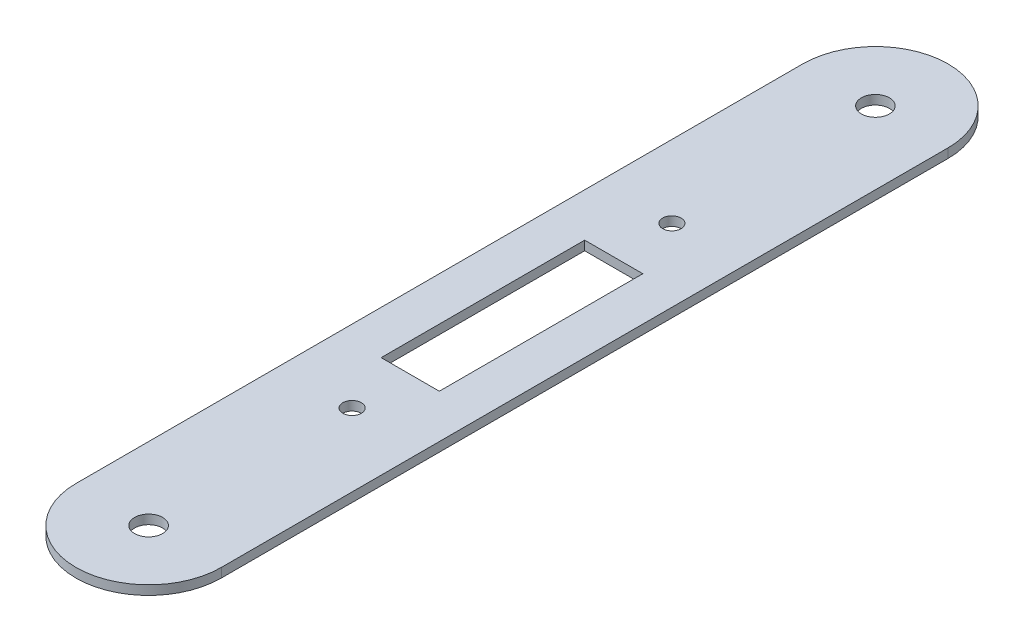
ISO-10303-21;
HEADER;
FILE_DESCRIPTION(('STEP AP214'),'2;1');
FILE_NAME('part.step','',(''),(''),'','','');
FILE_SCHEMA(('AUTOMOTIVE_DESIGN { 1 0 10303 214 1 1 1 1 }'));
ENDSEC;
DATA;
#1=APPLICATION_CONTEXT('core data for automotive mechanical design processes');
#2=APPLICATION_PROTOCOL_DEFINITION('international standard','automotive_design',2000,#1);
#3=PRODUCT_CONTEXT('',#1,'mechanical');
#4=PRODUCT('Part','Part','',(#3));
#5=PRODUCT_RELATED_PRODUCT_CATEGORY('part','',(#4));
#6=PRODUCT_DEFINITION_FORMATION('','',#4);
#7=PRODUCT_DEFINITION_CONTEXT('part definition',#1,'design');
#8=PRODUCT_DEFINITION('design','',#6,#7);
#9=PRODUCT_DEFINITION_SHAPE('','',#8);
#10=(LENGTH_UNIT() NAMED_UNIT(*) SI_UNIT(.MILLI.,.METRE.));
#11=(NAMED_UNIT(*) PLANE_ANGLE_UNIT() SI_UNIT($,.RADIAN.));
#12=(NAMED_UNIT(*) SI_UNIT($,.STERADIAN.) SOLID_ANGLE_UNIT());
#13=UNCERTAINTY_MEASURE_WITH_UNIT(LENGTH_MEASURE(1.E-05),#10,'distance_accuracy_value','');
#14=(GEOMETRIC_REPRESENTATION_CONTEXT(3) GLOBAL_UNCERTAINTY_ASSIGNED_CONTEXT((#13)) GLOBAL_UNIT_ASSIGNED_CONTEXT((#10,
#11,#12)) REPRESENTATION_CONTEXT('',''));
#15=CARTESIAN_POINT('',(0.,0.,0.));
#16=DIRECTION('',(0.,0.,1.));
#17=DIRECTION('',(1.,0.,0.));
#18=AXIS2_PLACEMENT_3D('',#15,#16,#17);
#19=CARTESIAN_POINT('',(0.,3.175,0.));
#20=DIRECTION('',(1.,0.,0.));
#21=DIRECTION('',(0.,0.,-1.));
#22=AXIS2_PLACEMENT_3D('',#19,#20,#21);
#23=PLANE('',#22);
#24=DIRECTION('',(0.,0.,1.));
#25=VECTOR('',#24,1.);
#26=CARTESIAN_POINT('',(0.,0.,0.));
#27=LINE('',#26,#25);
#28=CARTESIAN_POINT('',(0.,0.,25.));
#29=VERTEX_POINT('',#28);
#30=CARTESIAN_POINT('',(0.,0.,275.));
#31=VERTEX_POINT('',#30);
#32=EDGE_CURVE('E155',#29,#31,#27,.T.);
#33=ORIENTED_EDGE('',*,*,#32,.T.);
#34=DIRECTION('',(0.,-1.,0.));
#35=VECTOR('',#34,1.);
#36=CARTESIAN_POINT('',(0.,3.175,275.));
#37=LINE('',#36,#35);
#38=CARTESIAN_POINT('',(0.,3.175,275.));
#39=VERTEX_POINT('',#38);
#40=EDGE_CURVE('E11',#39,#31,#37,.T.);
#41=ORIENTED_EDGE('',*,*,#40,.F.);
#42=DIRECTION('',(0.,0.,1.));
#43=VECTOR('',#42,1.);
#44=CARTESIAN_POINT('',(0.,3.175,0.));
#45=LINE('',#44,#43);
#46=CARTESIAN_POINT('',(0.,3.175,25.));
#47=VERTEX_POINT('',#46);
#48=EDGE_CURVE('E114',#47,#39,#45,.T.);
#49=ORIENTED_EDGE('',*,*,#48,.F.);
#50=DIRECTION('',(0.,-1.,0.));
#51=VECTOR('',#50,1.);
#52=CARTESIAN_POINT('',(0.,3.175,25.));
#53=LINE('',#52,#51);
#54=EDGE_CURVE('E175',#47,#29,#53,.T.);
#55=ORIENTED_EDGE('',*,*,#54,.T.);
#56=EDGE_LOOP('',(#33,#41,#49,#55));
#57=FACE_BOUND('',#56,.T.);
#58=ADVANCED_FACE('F35',(#57),#23,.F.);
#59=CARTESIAN_POINT('',(25.,3.175,275.));
#60=DIRECTION('',(0.,-1.,0.));
#61=DIRECTION('',(0.,0.,-1.));
#62=AXIS2_PLACEMENT_3D('',#59,#60,#61);
#63=CYLINDRICAL_SURFACE('',#62,25.);
#64=CARTESIAN_POINT('',(25.,0.,275.));
#65=DIRECTION('',(0.,1.,0.));
#66=DIRECTION('',(0.,0.,1.));
#67=AXIS2_PLACEMENT_3D('',#64,#65,#66);
#68=CIRCLE('',#67,25.);
#69=CARTESIAN_POINT('',(50.,0.,275.));
#70=VERTEX_POINT('',#69);
#71=EDGE_CURVE('E120',#31,#70,#68,.T.);
#72=ORIENTED_EDGE('',*,*,#71,.T.);
#73=DIRECTION('',(0.,-1.,0.));
#74=VECTOR('',#73,1.);
#75=CARTESIAN_POINT('',(50.,3.175,275.));
#76=LINE('',#75,#74);
#77=CARTESIAN_POINT('',(50.,3.175,275.));
#78=VERTEX_POINT('',#77);
#79=EDGE_CURVE('E45',#78,#70,#76,.T.);
#80=ORIENTED_EDGE('',*,*,#79,.F.);
#81=CARTESIAN_POINT('',(25.,3.175,275.));
#82=DIRECTION('',(0.,1.,0.));
#83=DIRECTION('',(0.,0.,1.));
#84=AXIS2_PLACEMENT_3D('',#81,#82,#83);
#85=CIRCLE('',#84,25.);
#86=EDGE_CURVE('E107',#39,#78,#85,.T.);
#87=ORIENTED_EDGE('',*,*,#86,.F.);
#88=ORIENTED_EDGE('',*,*,#40,.T.);
#89=EDGE_LOOP('',(#72,#80,#87,#88));
#90=FACE_BOUND('',#89,.T.);
#91=ADVANCED_FACE('F119',(#90),#63,.T.);
#92=CARTESIAN_POINT('',(50.,3.175,0.));
#93=DIRECTION('',(1.,0.,0.));
#94=DIRECTION('',(0.,0.,-1.));
#95=AXIS2_PLACEMENT_3D('',#92,#93,#94);
#96=PLANE('',#95);
#97=DIRECTION('',(0.,0.,1.));
#98=VECTOR('',#97,1.);
#99=CARTESIAN_POINT('',(50.,0.,0.));
#100=LINE('',#99,#98);
#101=CARTESIAN_POINT('',(50.,0.,25.));
#102=VERTEX_POINT('',#101);
#103=EDGE_CURVE('E159',#102,#70,#100,.T.);
#104=ORIENTED_EDGE('',*,*,#103,.F.);
#105=DIRECTION('',(0.,-1.,0.));
#106=VECTOR('',#105,1.);
#107=CARTESIAN_POINT('',(50.,3.175,25.));
#108=LINE('',#107,#106);
#109=CARTESIAN_POINT('',(50.,3.175,25.));
#110=VERTEX_POINT('',#109);
#111=EDGE_CURVE('E82',#110,#102,#108,.T.);
#112=ORIENTED_EDGE('',*,*,#111,.F.);
#113=DIRECTION('',(0.,0.,1.));
#114=VECTOR('',#113,1.);
#115=CARTESIAN_POINT('',(50.,3.175,0.));
#116=LINE('',#115,#114);
#117=EDGE_CURVE('E112',#110,#78,#116,.T.);
#118=ORIENTED_EDGE('',*,*,#117,.T.);
#119=ORIENTED_EDGE('',*,*,#79,.T.);
#120=EDGE_LOOP('',(#104,#112,#118,#119));
#121=FACE_BOUND('',#120,.T.);
#122=ADVANCED_FACE('F125',(#121),#96,.T.);
#123=CARTESIAN_POINT('',(0.,3.175,115.));
#124=DIRECTION('',(0.,0.,-1.));
#125=DIRECTION('',(-1.,0.,0.));
#126=AXIS2_PLACEMENT_3D('',#123,#124,#125);
#127=PLANE('',#126);
#128=DIRECTION('',(1.,0.,0.));
#129=VECTOR('',#128,1.);
#130=CARTESIAN_POINT('',(0.,0.,115.));
#131=LINE('',#130,#129);
#132=CARTESIAN_POINT('',(15.,0.,115.));
#133=VERTEX_POINT('',#132);
#134=CARTESIAN_POINT('',(35.,0.,115.));
#135=VERTEX_POINT('',#134);
#136=EDGE_CURVE('E143',#133,#135,#131,.T.);
#137=ORIENTED_EDGE('',*,*,#136,.T.);
#138=DIRECTION('',(0.,-1.,0.));
#139=VECTOR('',#138,1.);
#140=CARTESIAN_POINT('',(35.,3.175,115.));
#141=LINE('',#140,#139);
#142=CARTESIAN_POINT('',(35.,3.175,115.));
#143=VERTEX_POINT('',#142);
#144=EDGE_CURVE('E39',#143,#135,#141,.T.);
#145=ORIENTED_EDGE('',*,*,#144,.F.);
#146=DIRECTION('',(1.,0.,0.));
#147=VECTOR('',#146,1.);
#148=CARTESIAN_POINT('',(0.,3.175,115.));
#149=LINE('',#148,#147);
#150=CARTESIAN_POINT('',(15.,3.175,115.));
#151=VERTEX_POINT('',#150);
#152=EDGE_CURVE('E174',#151,#143,#149,.T.);
#153=ORIENTED_EDGE('',*,*,#152,.F.);
#154=DIRECTION('',(0.,-1.,0.));
#155=VECTOR('',#154,1.);
#156=CARTESIAN_POINT('',(15.,3.175,115.));
#157=LINE('',#156,#155);
#158=EDGE_CURVE('E142',#151,#133,#157,.T.);
#159=ORIENTED_EDGE('',*,*,#158,.T.);
#160=EDGE_LOOP('',(#137,#145,#153,#159));
#161=FACE_BOUND('',#160,.T.);
#162=ADVANCED_FACE('F37',(#161),#127,.F.);
#163=CARTESIAN_POINT('',(35.,3.175,0.));
#164=DIRECTION('',(1.,0.,0.));
#165=DIRECTION('',(0.,0.,-1.));
#166=AXIS2_PLACEMENT_3D('',#163,#164,#165);
#167=PLANE('',#166);
#168=DIRECTION('',(0.,0.,1.));
#169=VECTOR('',#168,1.);
#170=CARTESIAN_POINT('',(35.,0.,0.));
#171=LINE('',#170,#169);
#172=CARTESIAN_POINT('',(35.,0.,185.));
#173=VERTEX_POINT('',#172);
#174=EDGE_CURVE('E146',#135,#173,#171,.T.);
#175=ORIENTED_EDGE('',*,*,#174,.T.);
#176=DIRECTION('',(0.,-1.,0.));
#177=VECTOR('',#176,1.);
#178=CARTESIAN_POINT('',(35.,3.175,185.));
#179=LINE('',#178,#177);
#180=CARTESIAN_POINT('',(35.,3.175,185.));
#181=VERTEX_POINT('',#180);
#182=EDGE_CURVE('E180',#181,#173,#179,.T.);
#183=ORIENTED_EDGE('',*,*,#182,.F.);
#184=DIRECTION('',(0.,0.,1.));
#185=VECTOR('',#184,1.);
#186=CARTESIAN_POINT('',(35.,3.175,0.));
#187=LINE('',#186,#185);
#188=EDGE_CURVE('E94',#143,#181,#187,.T.);
#189=ORIENTED_EDGE('',*,*,#188,.F.);
#190=ORIENTED_EDGE('',*,*,#144,.T.);
#191=EDGE_LOOP('',(#175,#183,#189,#190));
#192=FACE_BOUND('',#191,.T.);
#193=ADVANCED_FACE('F185',(#192),#167,.F.);
#194=CARTESIAN_POINT('',(0.,3.175,185.));
#195=DIRECTION('',(0.,0.,-1.));
#196=DIRECTION('',(-1.,0.,0.));
#197=AXIS2_PLACEMENT_3D('',#194,#195,#196);
#198=PLANE('',#197);
#199=DIRECTION('',(1.,0.,0.));
#200=VECTOR('',#199,1.);
#201=CARTESIAN_POINT('',(0.,0.,185.));
#202=LINE('',#201,#200);
#203=CARTESIAN_POINT('',(15.,0.,185.));
#204=VERTEX_POINT('',#203);
#205=EDGE_CURVE('E149',#204,#173,#202,.T.);
#206=ORIENTED_EDGE('',*,*,#205,.F.);
#207=DIRECTION('',(0.,-1.,0.));
#208=VECTOR('',#207,1.);
#209=CARTESIAN_POINT('',(15.,3.175,185.));
#210=LINE('',#209,#208);
#211=CARTESIAN_POINT('',(15.,3.175,185.));
#212=VERTEX_POINT('',#211);
#213=EDGE_CURVE('E179',#212,#204,#210,.T.);
#214=ORIENTED_EDGE('',*,*,#213,.F.);
#215=DIRECTION('',(1.,0.,0.));
#216=VECTOR('',#215,1.);
#217=CARTESIAN_POINT('',(0.,3.175,185.));
#218=LINE('',#217,#216);
#219=EDGE_CURVE('E318',#212,#181,#218,.T.);
#220=ORIENTED_EDGE('',*,*,#219,.T.);
#221=ORIENTED_EDGE('',*,*,#182,.T.);
#222=EDGE_LOOP('',(#206,#214,#220,#221));
#223=FACE_BOUND('',#222,.T.);
#224=ADVANCED_FACE('F199',(#223),#198,.T.);
#225=CARTESIAN_POINT('',(25.,3.175,25.));
#226=DIRECTION('',(0.,-1.,0.));
#227=DIRECTION('',(0.,0.,-1.));
#228=AXIS2_PLACEMENT_3D('',#225,#226,#227);
#229=CYLINDRICAL_SURFACE('',#228,4.82);
#230=CARTESIAN_POINT('',(25.,3.175,25.));
#231=DIRECTION('',(0.,1.,0.));
#232=DIRECTION('',(0.,0.,1.));
#233=AXIS2_PLACEMENT_3D('',#230,#231,#232);
#234=CIRCLE('',#233,4.82);
#235=CARTESIAN_POINT('',(25.,3.175,29.82));
#236=VERTEX_POINT('',#235);
#237=EDGE_CURVE('E136',#236,#236,#234,.T.);
#238=ORIENTED_EDGE('',*,*,#237,.T.);
#239=EDGE_LOOP('',(#238));
#240=FACE_BOUND('',#239,.T.);
#241=CARTESIAN_POINT('',(25.,0.,25.));
#242=DIRECTION('',(0.,1.,0.));
#243=DIRECTION('',(0.,0.,1.));
#244=AXIS2_PLACEMENT_3D('',#241,#242,#243);
#245=CIRCLE('',#244,4.82);
#246=CARTESIAN_POINT('',(25.,0.,29.82));
#247=VERTEX_POINT('',#246);
#248=EDGE_CURVE('E168',#247,#247,#245,.T.);
#249=ORIENTED_EDGE('',*,*,#248,.F.);
#250=EDGE_LOOP('',(#249));
#251=FACE_BOUND('',#250,.T.);
#252=ADVANCED_FACE('F201',(#240,#251),#229,.F.);
#253=CARTESIAN_POINT('',(25.,3.175,205.));
#254=DIRECTION('',(0.,-1.,0.));
#255=DIRECTION('',(0.,0.,-1.));
#256=AXIS2_PLACEMENT_3D('',#253,#254,#255);
#257=CYLINDRICAL_SURFACE('',#256,3.175);
#258=CARTESIAN_POINT('',(25.,3.175,205.));
#259=DIRECTION('',(0.,1.,0.));
#260=DIRECTION('',(0.,0.,1.));
#261=AXIS2_PLACEMENT_3D('',#258,#259,#260);
#262=CIRCLE('',#261,3.175);
#263=CARTESIAN_POINT('',(25.,3.175,208.175));
#264=VERTEX_POINT('',#263);
#265=EDGE_CURVE('E133',#264,#264,#262,.F.);
#266=ORIENTED_EDGE('',*,*,#265,.F.);
#267=EDGE_LOOP('',(#266));
#268=FACE_BOUND('',#267,.T.);
#269=CARTESIAN_POINT('',(25.,0.,205.));
#270=DIRECTION('',(0.,1.,0.));
#271=DIRECTION('',(0.,0.,1.));
#272=AXIS2_PLACEMENT_3D('',#269,#270,#271);
#273=CIRCLE('',#272,3.175);
#274=CARTESIAN_POINT('',(25.,0.,208.175));
#275=VERTEX_POINT('',#274);
#276=EDGE_CURVE('E165',#275,#275,#273,.F.);
#277=ORIENTED_EDGE('',*,*,#276,.T.);
#278=EDGE_LOOP('',(#277));
#279=FACE_BOUND('',#278,.T.);
#280=ADVANCED_FACE('F207',(#268,#279),#257,.F.);
#281=CARTESIAN_POINT('',(25.,3.175,95.));
#282=DIRECTION('',(0.,-1.,0.));
#283=DIRECTION('',(0.,0.,-1.));
#284=AXIS2_PLACEMENT_3D('',#281,#282,#283);
#285=CYLINDRICAL_SURFACE('',#284,3.175);
#286=CARTESIAN_POINT('',(25.,3.175,95.));
#287=DIRECTION('',(0.,1.,0.));
#288=DIRECTION('',(0.,0.,1.));
#289=AXIS2_PLACEMENT_3D('',#286,#287,#288);
#290=CIRCLE('',#289,3.175);
#291=CARTESIAN_POINT('',(25.,3.175,98.175));
#292=VERTEX_POINT('',#291);
#293=EDGE_CURVE('E127',#292,#292,#290,.T.);
#294=ORIENTED_EDGE('',*,*,#293,.T.);
#295=EDGE_LOOP('',(#294));
#296=FACE_BOUND('',#295,.T.);
#297=CARTESIAN_POINT('',(25.,0.,95.));
#298=DIRECTION('',(0.,1.,0.));
#299=DIRECTION('',(0.,0.,1.));
#300=AXIS2_PLACEMENT_3D('',#297,#298,#299);
#301=CIRCLE('',#300,3.175);
#302=CARTESIAN_POINT('',(25.,0.,98.175));
#303=VERTEX_POINT('',#302);
#304=EDGE_CURVE('E162',#303,#303,#301,.T.);
#305=ORIENTED_EDGE('',*,*,#304,.F.);
#306=EDGE_LOOP('',(#305));
#307=FACE_BOUND('',#306,.T.);
#308=ADVANCED_FACE('F228',(#296,#307),#285,.F.);
#309=CARTESIAN_POINT('',(25.,3.175,25.));
#310=DIRECTION('',(0.,-1.,0.));
#311=DIRECTION('',(0.,0.,-1.));
#312=AXIS2_PLACEMENT_3D('',#309,#310,#311);
#313=CYLINDRICAL_SURFACE('',#312,25.);
#314=CARTESIAN_POINT('',(25.,0.,25.));
#315=DIRECTION('',(0.,1.,0.));
#316=DIRECTION('',(0.,0.,1.));
#317=AXIS2_PLACEMENT_3D('',#314,#315,#316);
#318=CIRCLE('',#317,25.);
#319=EDGE_CURVE('E85',#102,#29,#318,.T.);
#320=ORIENTED_EDGE('',*,*,#319,.T.);
#321=ORIENTED_EDGE('',*,*,#54,.F.);
#322=CARTESIAN_POINT('',(25.,3.175,25.));
#323=DIRECTION('',(0.,1.,0.));
#324=DIRECTION('',(0.,0.,1.));
#325=AXIS2_PLACEMENT_3D('',#322,#323,#324);
#326=CIRCLE('',#325,25.);
#327=EDGE_CURVE('E54',#110,#47,#326,.T.);
#328=ORIENTED_EDGE('',*,*,#327,.F.);
#329=ORIENTED_EDGE('',*,*,#111,.T.);
#330=EDGE_LOOP('',(#320,#321,#328,#329));
#331=FACE_BOUND('',#330,.T.);
#332=ADVANCED_FACE('F221',(#331),#313,.T.);
#333=CARTESIAN_POINT('',(15.,3.175,0.));
#334=DIRECTION('',(1.,0.,0.));
#335=DIRECTION('',(0.,0.,-1.));
#336=AXIS2_PLACEMENT_3D('',#333,#334,#335);
#337=PLANE('',#336);
#338=DIRECTION('',(0.,0.,1.));
#339=VECTOR('',#338,1.);
#340=CARTESIAN_POINT('',(15.,0.,0.));
#341=LINE('',#340,#339);
#342=EDGE_CURVE('E152',#133,#204,#341,.T.);
#343=ORIENTED_EDGE('',*,*,#342,.F.);
#344=ORIENTED_EDGE('',*,*,#158,.F.);
#345=DIRECTION('',(0.,0.,1.));
#346=VECTOR('',#345,1.);
#347=CARTESIAN_POINT('',(15.,3.175,0.));
#348=LINE('',#347,#346);
#349=EDGE_CURVE('E197',#151,#212,#348,.T.);
#350=ORIENTED_EDGE('',*,*,#349,.T.);
#351=ORIENTED_EDGE('',*,*,#213,.T.);
#352=EDGE_LOOP('',(#343,#344,#350,#351));
#353=FACE_BOUND('',#352,.T.);
#354=ADVANCED_FACE('F194',(#353),#337,.T.);
#355=CARTESIAN_POINT('',(25.,3.175,275.));
#356=DIRECTION('',(0.,-1.,0.));
#357=DIRECTION('',(0.,0.,-1.));
#358=AXIS2_PLACEMENT_3D('',#355,#356,#357);
#359=CYLINDRICAL_SURFACE('',#358,4.82);
#360=CARTESIAN_POINT('',(25.,3.175,275.));
#361=DIRECTION('',(0.,1.,0.));
#362=DIRECTION('',(0.,0.,1.));
#363=AXIS2_PLACEMENT_3D('',#360,#361,#362);
#364=CIRCLE('',#363,4.82);
#365=CARTESIAN_POINT('',(25.,3.175,279.82));
#366=VERTEX_POINT('',#365);
#367=EDGE_CURVE('E139',#366,#366,#364,.F.);
#368=ORIENTED_EDGE('',*,*,#367,.F.);
#369=EDGE_LOOP('',(#368));
#370=FACE_BOUND('',#369,.T.);
#371=CARTESIAN_POINT('',(25.,0.,275.));
#372=DIRECTION('',(0.,1.,0.));
#373=DIRECTION('',(0.,0.,1.));
#374=AXIS2_PLACEMENT_3D('',#371,#372,#373);
#375=CIRCLE('',#374,4.82);
#376=CARTESIAN_POINT('',(25.,0.,279.82));
#377=VERTEX_POINT('',#376);
#378=EDGE_CURVE('E171',#377,#377,#375,.F.);
#379=ORIENTED_EDGE('',*,*,#378,.T.);
#380=EDGE_LOOP('',(#379));
#381=FACE_BOUND('',#380,.T.);
#382=ADVANCED_FACE('F220',(#370,#381),#359,.F.);
#383=CARTESIAN_POINT('',(0.,3.175,0.));
#384=DIRECTION('',(0.,1.,0.));
#385=DIRECTION('',(0.,0.,1.));
#386=AXIS2_PLACEMENT_3D('',#383,#384,#385);
#387=PLANE('',#386);
#388=ORIENTED_EDGE('',*,*,#152,.T.);
#389=ORIENTED_EDGE('',*,*,#188,.T.);
#390=ORIENTED_EDGE('',*,*,#219,.F.);
#391=ORIENTED_EDGE('',*,*,#349,.F.);
#392=EDGE_LOOP('',(#388,#389,#390,#391));
#393=FACE_BOUND('',#392,.T.);
#394=ORIENTED_EDGE('',*,*,#48,.T.);
#395=ORIENTED_EDGE('',*,*,#86,.T.);
#396=ORIENTED_EDGE('',*,*,#117,.F.);
#397=ORIENTED_EDGE('',*,*,#327,.T.);
#398=EDGE_LOOP('',(#394,#395,#396,#397));
#399=FACE_BOUND('',#398,.T.);
#400=ORIENTED_EDGE('',*,*,#293,.F.);
#401=EDGE_LOOP('',(#400));
#402=FACE_BOUND('',#401,.T.);
#403=ORIENTED_EDGE('',*,*,#265,.T.);
#404=EDGE_LOOP('',(#403));
#405=FACE_BOUND('',#404,.T.);
#406=ORIENTED_EDGE('',*,*,#237,.F.);
#407=EDGE_LOOP('',(#406));
#408=FACE_BOUND('',#407,.T.);
#409=ORIENTED_EDGE('',*,*,#367,.T.);
#410=EDGE_LOOP('',(#409));
#411=FACE_BOUND('',#410,.T.);
#412=ADVANCED_FACE('F109',(#393,#399,#402,#405,#408,#411),#387,.T.);
#413=CARTESIAN_POINT('',(0.,0.,0.));
#414=DIRECTION('',(0.,1.,0.));
#415=DIRECTION('',(0.,0.,1.));
#416=AXIS2_PLACEMENT_3D('',#413,#414,#415);
#417=PLANE('',#416);
#418=ORIENTED_EDGE('',*,*,#136,.F.);
#419=ORIENTED_EDGE('',*,*,#342,.T.);
#420=ORIENTED_EDGE('',*,*,#205,.T.);
#421=ORIENTED_EDGE('',*,*,#174,.F.);
#422=EDGE_LOOP('',(#418,#419,#420,#421));
#423=FACE_BOUND('',#422,.T.);
#424=ORIENTED_EDGE('',*,*,#32,.F.);
#425=ORIENTED_EDGE('',*,*,#319,.F.);
#426=ORIENTED_EDGE('',*,*,#103,.T.);
#427=ORIENTED_EDGE('',*,*,#71,.F.);
#428=EDGE_LOOP('',(#424,#425,#426,#427));
#429=FACE_BOUND('',#428,.T.);
#430=ORIENTED_EDGE('',*,*,#304,.T.);
#431=EDGE_LOOP('',(#430));
#432=FACE_BOUND('',#431,.T.);
#433=ORIENTED_EDGE('',*,*,#276,.F.);
#434=EDGE_LOOP('',(#433));
#435=FACE_BOUND('',#434,.T.);
#436=ORIENTED_EDGE('',*,*,#248,.T.);
#437=EDGE_LOOP('',(#436));
#438=FACE_BOUND('',#437,.T.);
#439=ORIENTED_EDGE('',*,*,#378,.F.);
#440=EDGE_LOOP('',(#439));
#441=FACE_BOUND('',#440,.T.);
#442=ADVANCED_FACE('F191',(#423,#429,#432,#435,#438,#441),#417,.F.);
#443=CLOSED_SHELL('',(#58,#91,#122,#162,#193,#224,#252,#280,#308,#332,#354,#382,#412,#442));
#444=MANIFOLD_SOLID_BREP('B2',#443);
#445=ADVANCED_BREP_SHAPE_REPRESENTATION('',(#18,#444),#14);
#446=SHAPE_DEFINITION_REPRESENTATION(#9,#445);
ENDSEC;
END-ISO-10303-21;
